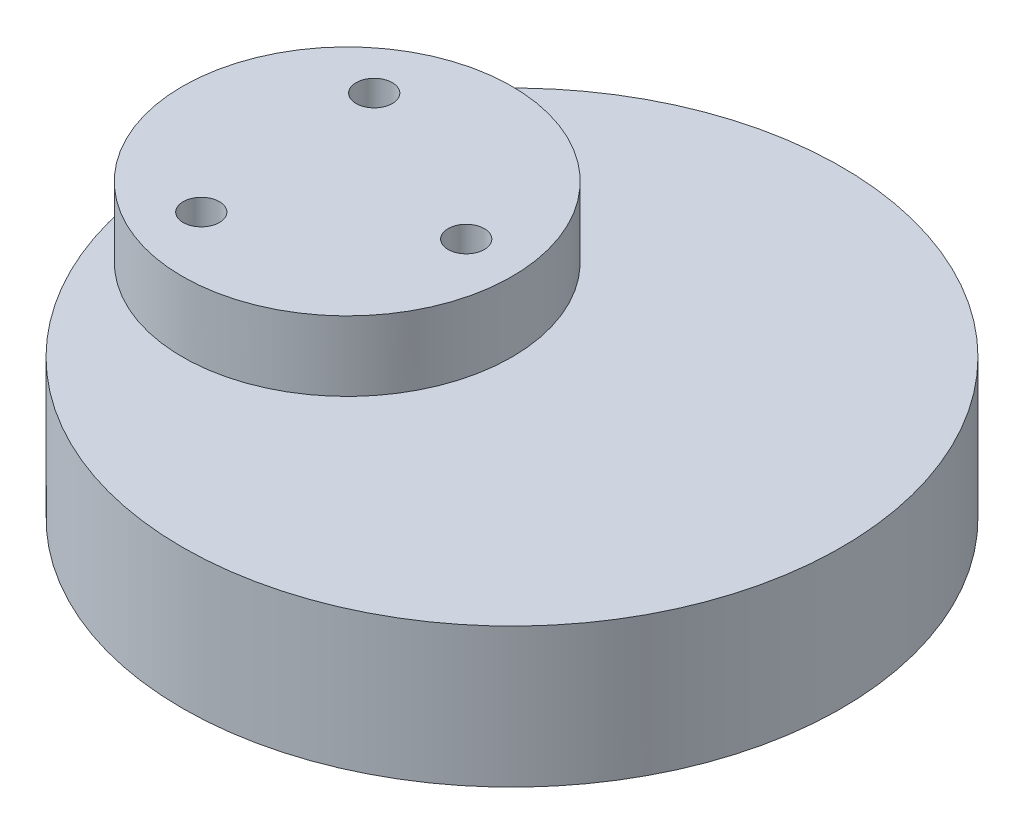
ISO-10303-21;
HEADER;
FILE_DESCRIPTION(('STEP AP214'),'2;1');
FILE_NAME('part.step','',(''),(''),'','','');
FILE_SCHEMA(('AUTOMOTIVE_DESIGN { 1 0 10303 214 1 1 1 1 }'));
ENDSEC;
DATA;
#1=APPLICATION_CONTEXT('core data for automotive mechanical design processes');
#2=APPLICATION_PROTOCOL_DEFINITION('international standard','automotive_design',2000,#1);
#3=PRODUCT_CONTEXT('',#1,'mechanical');
#4=PRODUCT('Part','Part','',(#3));
#5=PRODUCT_RELATED_PRODUCT_CATEGORY('part','',(#4));
#6=PRODUCT_DEFINITION_FORMATION('','',#4);
#7=PRODUCT_DEFINITION_CONTEXT('part definition',#1,'design');
#8=PRODUCT_DEFINITION('design','',#6,#7);
#9=PRODUCT_DEFINITION_SHAPE('','',#8);
#10=(LENGTH_UNIT() NAMED_UNIT(*) SI_UNIT(.MILLI.,.METRE.));
#11=(NAMED_UNIT(*) PLANE_ANGLE_UNIT() SI_UNIT($,.RADIAN.));
#12=(NAMED_UNIT(*) SI_UNIT($,.STERADIAN.) SOLID_ANGLE_UNIT());
#13=UNCERTAINTY_MEASURE_WITH_UNIT(LENGTH_MEASURE(1.E-05),#10,'distance_accuracy_value','');
#14=(GEOMETRIC_REPRESENTATION_CONTEXT(3) GLOBAL_UNCERTAINTY_ASSIGNED_CONTEXT((#13)) GLOBAL_UNIT_ASSIGNED_CONTEXT((#10,
#11,#12)) REPRESENTATION_CONTEXT('',''));
#15=CARTESIAN_POINT('',(0.,0.,0.));
#16=DIRECTION('',(0.,0.,1.));
#17=DIRECTION('',(1.,0.,0.));
#18=AXIS2_PLACEMENT_3D('',#15,#16,#17);
#19=CARTESIAN_POINT('',(0.,6.35,0.));
#20=DIRECTION('',(0.,-1.,0.));
#21=DIRECTION('',(0.,0.,-1.));
#22=AXIS2_PLACEMENT_3D('',#19,#20,#21);
#23=CYLINDRICAL_SURFACE('',#22,15.);
#24=CARTESIAN_POINT('',(0.,6.35,0.));
#25=DIRECTION('',(0.,1.,0.));
#26=DIRECTION('',(0.,0.,1.));
#27=AXIS2_PLACEMENT_3D('',#24,#25,#26);
#28=CIRCLE('',#27,15.);
#29=CARTESIAN_POINT('',(0.,6.35,15.));
#30=VERTEX_POINT('',#29);
#31=EDGE_CURVE('E11',#30,#30,#28,.T.);
#32=ORIENTED_EDGE('',*,*,#31,.F.);
#33=EDGE_LOOP('',(#32));
#34=FACE_BOUND('',#33,.T.);
#35=CARTESIAN_POINT('',(0.,0.,0.));
#36=DIRECTION('',(0.,1.,0.));
#37=DIRECTION('',(0.,0.,1.));
#38=AXIS2_PLACEMENT_3D('',#35,#36,#37);
#39=CIRCLE('',#38,15.);
#40=CARTESIAN_POINT('',(-15.,0.,0.));
#41=VERTEX_POINT('',#40);
#42=EDGE_CURVE('E48',#41,#41,#39,.T.);
#43=ORIENTED_EDGE('',*,*,#42,.T.);
#44=EDGE_LOOP('',(#43));
#45=FACE_BOUND('',#44,.T.);
#46=ADVANCED_FACE('F45',(#34,#45),#23,.T.);
#47=CARTESIAN_POINT('',(0.,6.35,0.));
#48=DIRECTION('',(0.,1.,0.));
#49=DIRECTION('',(0.,0.,1.));
#50=AXIS2_PLACEMENT_3D('',#47,#48,#49);
#51=PLANE('',#50);
#52=CARTESIAN_POINT('',(-4.226182617407,6.35,9.0630778703665));
#53=DIRECTION('',(0.,1.,0.));
#54=DIRECTION('',(0.,0.,1.));
#55=AXIS2_PLACEMENT_3D('',#52,#53,#54);
#56=CIRCLE('',#55,1.64999999999999);
#57=CARTESIAN_POINT('',(-4.226182617407,6.35,10.7130778703665));
#58=VERTEX_POINT('',#57);
#59=EDGE_CURVE('E105',#58,#58,#56,.T.);
#60=ORIENTED_EDGE('',*,*,#59,.F.);
#61=EDGE_LOOP('',(#60));
#62=FACE_BOUND('',#61,.T.);
#63=CARTESIAN_POINT('',(9.96194698091746,6.35,-0.87155742747655));
#64=DIRECTION('',(0.,1.,0.));
#65=DIRECTION('',(0.,0.,1.));
#66=AXIS2_PLACEMENT_3D('',#63,#64,#65);
#67=CIRCLE('',#66,1.64999999999999);
#68=CARTESIAN_POINT('',(9.96194698091746,6.35,0.77844257252344));
#69=VERTEX_POINT('',#68);
#70=EDGE_CURVE('E111',#69,#69,#67,.T.);
#71=ORIENTED_EDGE('',*,*,#70,.F.);
#72=EDGE_LOOP('',(#71));
#73=FACE_BOUND('',#72,.T.);
#74=CARTESIAN_POINT('',(-5.73576436351042,6.35,-8.19152044288995));
#75=DIRECTION('',(0.,1.,0.));
#76=DIRECTION('',(0.,0.,1.));
#77=AXIS2_PLACEMENT_3D('',#74,#75,#76);
#78=CIRCLE('',#77,1.64999999999999);
#79=CARTESIAN_POINT('',(-5.73576436351042,6.35,-6.54152044288996));
#80=VERTEX_POINT('',#79);
#81=EDGE_CURVE('E118',#80,#80,#78,.T.);
#82=ORIENTED_EDGE('',*,*,#81,.F.);
#83=EDGE_LOOP('',(#82));
#84=FACE_BOUND('',#83,.T.);
#85=ORIENTED_EDGE('',*,*,#31,.T.);
#86=EDGE_LOOP('',(#85));
#87=FACE_BOUND('',#86,.T.);
#88=ADVANCED_FACE('F134',(#62,#73,#84,#87),#51,.T.);
#89=CARTESIAN_POINT('',(15.,-12.7,0.));
#90=DIRECTION('',(0.,1.,0.));
#91=DIRECTION('',(0.,0.,1.));
#92=AXIS2_PLACEMENT_3D('',#89,#90,#91);
#93=CYLINDRICAL_SURFACE('',#92,30.);
#94=CARTESIAN_POINT('',(15.,-12.7,0.));
#95=DIRECTION('',(0.,1.,0.));
#96=DIRECTION('',(0.,0.,1.));
#97=AXIS2_PLACEMENT_3D('',#94,#95,#96);
#98=CIRCLE('',#97,30.);
#99=CARTESIAN_POINT('',(15.,-12.7,30.));
#100=VERTEX_POINT('',#99);
#101=EDGE_CURVE('E124',#100,#100,#98,.T.);
#102=ORIENTED_EDGE('',*,*,#101,.T.);
#103=EDGE_LOOP('',(#102));
#104=FACE_BOUND('',#103,.T.);
#105=CARTESIAN_POINT('',(15.,0.,0.));
#106=DIRECTION('',(0.,1.,0.));
#107=DIRECTION('',(0.,0.,1.));
#108=AXIS2_PLACEMENT_3D('',#105,#106,#107);
#109=CIRCLE('',#108,30.);
#110=EDGE_CURVE('E58',#41,#41,#109,.T.);
#111=ORIENTED_EDGE('',*,*,#110,.F.);
#112=EDGE_LOOP('',(#111));
#113=FACE_BOUND('',#112,.T.);
#114=ADVANCED_FACE('F139',(#104,#113),#93,.T.);
#115=CARTESIAN_POINT('',(0.,-12.7,0.));
#116=DIRECTION('',(0.,1.,0.));
#117=DIRECTION('',(0.,0.,1.));
#118=AXIS2_PLACEMENT_3D('',#115,#116,#117);
#119=PLANE('',#118);
#120=CARTESIAN_POINT('',(15.,-12.7,20.));
#121=DIRECTION('',(0.,-1.,0.));
#122=DIRECTION('',(0.,0.,-1.));
#123=AXIS2_PLACEMENT_3D('',#120,#121,#122);
#124=CIRCLE('',#123,1.64999999999999);
#125=CARTESIAN_POINT('',(15.,-12.7,18.35));
#126=VERTEX_POINT('',#125);
#127=EDGE_CURVE('E89',#126,#126,#124,.T.);
#128=ORIENTED_EDGE('',*,*,#127,.F.);
#129=EDGE_LOOP('',(#128));
#130=FACE_BOUND('',#129,.T.);
#131=CARTESIAN_POINT('',(-2.32050807568879,-12.7,-9.99999999999996));
#132=DIRECTION('',(0.,-1.,0.));
#133=DIRECTION('',(0.,0.,-1.));
#134=AXIS2_PLACEMENT_3D('',#131,#132,#133);
#135=CIRCLE('',#134,1.64999999999999);
#136=CARTESIAN_POINT('',(-2.32050807568879,-12.7,-11.65));
#137=VERTEX_POINT('',#136);
#138=EDGE_CURVE('E88',#137,#137,#135,.T.);
#139=ORIENTED_EDGE('',*,*,#138,.F.);
#140=EDGE_LOOP('',(#139));
#141=FACE_BOUND('',#140,.T.);
#142=CARTESIAN_POINT('',(32.3205080756887,-12.7,-10.0000000000001));
#143=DIRECTION('',(0.,-1.,0.));
#144=DIRECTION('',(0.,0.,-1.));
#145=AXIS2_PLACEMENT_3D('',#142,#143,#144);
#146=CIRCLE('',#145,1.64999999999999);
#147=CARTESIAN_POINT('',(32.3205080756887,-12.7,-11.6500000000001));
#148=VERTEX_POINT('',#147);
#149=EDGE_CURVE('E99',#148,#148,#146,.T.);
#150=ORIENTED_EDGE('',*,*,#149,.F.);
#151=EDGE_LOOP('',(#150));
#152=FACE_BOUND('',#151,.T.);
#153=ORIENTED_EDGE('',*,*,#101,.F.);
#154=EDGE_LOOP('',(#153));
#155=FACE_BOUND('',#154,.T.);
#156=ADVANCED_FACE('F146',(#130,#141,#152,#155),#119,.F.);
#157=CARTESIAN_POINT('',(0.,0.,0.));
#158=DIRECTION('',(0.,1.,0.));
#159=DIRECTION('',(0.,0.,1.));
#160=AXIS2_PLACEMENT_3D('',#157,#158,#159);
#161=PLANE('',#160);
#162=ORIENTED_EDGE('',*,*,#110,.T.);
#163=ORIENTED_EDGE('',*,*,#42,.F.);
#164=EDGE_LOOP('',(#162,#163));
#165=FACE_BOUND('',#164,.T.);
#166=ADVANCED_FACE('F129',(#165),#161,.T.);
#167=CARTESIAN_POINT('',(-5.73576436351042,-3.75,-8.19152044288995));
#168=DIRECTION('',(0.,1.,0.));
#169=DIRECTION('',(0.,0.,1.));
#170=AXIS2_PLACEMENT_3D('',#167,#168,#169);
#171=CONICAL_SURFACE('',#170,1.64999999999999,1.02974425867665);
#172=CARTESIAN_POINT('',(-5.73576436351042,-4.74142002139548,-8.19152044288995));
#173=VERTEX_POINT('',#172);
#174=VERTEX_LOOP('',#173);
#175=FACE_BOUND('',#174,.T.);
#176=CARTESIAN_POINT('',(-5.73576436351042,-3.75,-8.19152044288995));
#177=DIRECTION('',(0.,1.,0.));
#178=DIRECTION('',(0.,0.,1.));
#179=AXIS2_PLACEMENT_3D('',#176,#177,#178);
#180=CIRCLE('',#179,1.64999999999999);
#181=CARTESIAN_POINT('',(-5.73576436351042,-3.75,-6.54152044288996));
#182=VERTEX_POINT('',#181);
#183=EDGE_CURVE('E121',#182,#182,#180,.T.);
#184=ORIENTED_EDGE('',*,*,#183,.T.);
#185=EDGE_LOOP('',(#184));
#186=FACE_BOUND('',#185,.T.);
#187=ADVANCED_FACE('F154',(#175,#186),#171,.F.);
#188=CARTESIAN_POINT('',(-5.73576436351042,6.35,-8.19152044288995));
#189=DIRECTION('',(0.,1.,0.));
#190=DIRECTION('',(0.,0.,1.));
#191=AXIS2_PLACEMENT_3D('',#188,#189,#190);
#192=CYLINDRICAL_SURFACE('',#191,1.64999999999999);
#193=ORIENTED_EDGE('',*,*,#183,.F.);
#194=EDGE_LOOP('',(#193));
#195=FACE_BOUND('',#194,.T.);
#196=ORIENTED_EDGE('',*,*,#81,.T.);
#197=EDGE_LOOP('',(#196));
#198=FACE_BOUND('',#197,.T.);
#199=ADVANCED_FACE('F160',(#195,#198),#192,.F.);
#200=CARTESIAN_POINT('',(9.96194698091746,-3.75,-0.87155742747655));
#201=DIRECTION('',(0.,1.,0.));
#202=DIRECTION('',(0.,0.,1.));
#203=AXIS2_PLACEMENT_3D('',#200,#201,#202);
#204=CONICAL_SURFACE('',#203,1.64999999999999,1.02974425867665);
#205=CARTESIAN_POINT('',(9.96194698091746,-4.74142002139548,-0.87155742747655));
#206=VERTEX_POINT('',#205);
#207=VERTEX_LOOP('',#206);
#208=FACE_BOUND('',#207,.T.);
#209=CARTESIAN_POINT('',(9.96194698091746,-3.75,-0.87155742747655));
#210=DIRECTION('',(0.,1.,0.));
#211=DIRECTION('',(0.,0.,1.));
#212=AXIS2_PLACEMENT_3D('',#209,#210,#211);
#213=CIRCLE('',#212,1.64999999999999);
#214=CARTESIAN_POINT('',(9.96194698091746,-3.75,0.778442572523438));
#215=VERTEX_POINT('',#214);
#216=EDGE_CURVE('E114',#215,#215,#213,.T.);
#217=ORIENTED_EDGE('',*,*,#216,.T.);
#218=EDGE_LOOP('',(#217));
#219=FACE_BOUND('',#218,.T.);
#220=ADVANCED_FACE('F163',(#208,#219),#204,.F.);
#221=CARTESIAN_POINT('',(9.96194698091746,6.35,-0.87155742747655));
#222=DIRECTION('',(0.,1.,0.));
#223=DIRECTION('',(0.,0.,1.));
#224=AXIS2_PLACEMENT_3D('',#221,#222,#223);
#225=CYLINDRICAL_SURFACE('',#224,1.64999999999999);
#226=ORIENTED_EDGE('',*,*,#216,.F.);
#227=EDGE_LOOP('',(#226));
#228=FACE_BOUND('',#227,.T.);
#229=ORIENTED_EDGE('',*,*,#70,.T.);
#230=EDGE_LOOP('',(#229));
#231=FACE_BOUND('',#230,.T.);
#232=ADVANCED_FACE('F167',(#228,#231),#225,.F.);
#233=CARTESIAN_POINT('',(-4.226182617407,-3.75,9.0630778703665));
#234=DIRECTION('',(0.,1.,0.));
#235=DIRECTION('',(0.,0.,1.));
#236=AXIS2_PLACEMENT_3D('',#233,#234,#235);
#237=CONICAL_SURFACE('',#236,1.64999999999999,1.02974425867665);
#238=CARTESIAN_POINT('',(-4.22618261740701,-4.74142002139548,9.0630778703665));
#239=VERTEX_POINT('',#238);
#240=VERTEX_LOOP('',#239);
#241=FACE_BOUND('',#240,.T.);
#242=CARTESIAN_POINT('',(-4.226182617407,-3.75,9.0630778703665));
#243=DIRECTION('',(0.,1.,0.));
#244=DIRECTION('',(0.,0.,1.));
#245=AXIS2_PLACEMENT_3D('',#242,#243,#244);
#246=CIRCLE('',#245,1.64999999999999);
#247=CARTESIAN_POINT('',(-4.226182617407,-3.75,10.7130778703665));
#248=VERTEX_POINT('',#247);
#249=EDGE_CURVE('E108',#248,#248,#246,.T.);
#250=ORIENTED_EDGE('',*,*,#249,.T.);
#251=EDGE_LOOP('',(#250));
#252=FACE_BOUND('',#251,.T.);
#253=ADVANCED_FACE('F171',(#241,#252),#237,.F.);
#254=CARTESIAN_POINT('',(-4.226182617407,6.35,9.0630778703665));
#255=DIRECTION('',(0.,1.,0.));
#256=DIRECTION('',(0.,0.,1.));
#257=AXIS2_PLACEMENT_3D('',#254,#255,#256);
#258=CYLINDRICAL_SURFACE('',#257,1.64999999999999);
#259=ORIENTED_EDGE('',*,*,#249,.F.);
#260=EDGE_LOOP('',(#259));
#261=FACE_BOUND('',#260,.T.);
#262=ORIENTED_EDGE('',*,*,#59,.T.);
#263=EDGE_LOOP('',(#262));
#264=FACE_BOUND('',#263,.T.);
#265=ADVANCED_FACE('F175',(#261,#264),#258,.F.);
#266=CARTESIAN_POINT('',(32.3205080756887,-2.6,-10.0000000000001));
#267=DIRECTION('',(0.,-1.,0.));
#268=DIRECTION('',(0.,0.,-1.));
#269=AXIS2_PLACEMENT_3D('',#266,#267,#268);
#270=CONICAL_SURFACE('',#269,1.64999999999998,1.02974425867665);
#271=CARTESIAN_POINT('',(32.3205080756887,-1.60857997860452,-10.0000000000001));
#272=VERTEX_POINT('',#271);
#273=VERTEX_LOOP('',#272);
#274=FACE_BOUND('',#273,.T.);
#275=CARTESIAN_POINT('',(32.3205080756887,-2.6,-10.0000000000001));
#276=DIRECTION('',(0.,-1.,0.));
#277=DIRECTION('',(0.,0.,-1.));
#278=AXIS2_PLACEMENT_3D('',#275,#276,#277);
#279=CIRCLE('',#278,1.64999999999998);
#280=CARTESIAN_POINT('',(32.3205080756887,-2.6,-11.6500000000001));
#281=VERTEX_POINT('',#280);
#282=EDGE_CURVE('E102',#281,#281,#279,.T.);
#283=ORIENTED_EDGE('',*,*,#282,.T.);
#284=EDGE_LOOP('',(#283));
#285=FACE_BOUND('',#284,.T.);
#286=ADVANCED_FACE('F179',(#274,#285),#270,.F.);
#287=CARTESIAN_POINT('',(32.3205080756887,-12.7,-10.0000000000001));
#288=DIRECTION('',(0.,-1.,0.));
#289=DIRECTION('',(0.,0.,-1.));
#290=AXIS2_PLACEMENT_3D('',#287,#288,#289);
#291=CYLINDRICAL_SURFACE('',#290,1.64999999999999);
#292=ORIENTED_EDGE('',*,*,#282,.F.);
#293=EDGE_LOOP('',(#292));
#294=FACE_BOUND('',#293,.T.);
#295=ORIENTED_EDGE('',*,*,#149,.T.);
#296=EDGE_LOOP('',(#295));
#297=FACE_BOUND('',#296,.T.);
#298=ADVANCED_FACE('F183',(#294,#297),#291,.F.);
#299=CARTESIAN_POINT('',(-2.32050807568879,-2.6,-9.99999999999996));
#300=DIRECTION('',(0.,-1.,0.));
#301=DIRECTION('',(0.,0.,-1.));
#302=AXIS2_PLACEMENT_3D('',#299,#300,#301);
#303=CONICAL_SURFACE('',#302,1.64999999999999,1.02974425867665);
#304=CARTESIAN_POINT('',(-2.3205080756888,-1.60857997860452,-9.99999999999996));
#305=VERTEX_POINT('',#304);
#306=VERTEX_LOOP('',#305);
#307=FACE_BOUND('',#306,.T.);
#308=CARTESIAN_POINT('',(-2.32050807568879,-2.6,-9.99999999999996));
#309=DIRECTION('',(0.,-1.,0.));
#310=DIRECTION('',(0.,0.,-1.));
#311=AXIS2_PLACEMENT_3D('',#308,#309,#310);
#312=CIRCLE('',#311,1.64999999999999);
#313=CARTESIAN_POINT('',(-2.32050807568879,-2.6,-11.6499999999999));
#314=VERTEX_POINT('',#313);
#315=EDGE_CURVE('E92',#314,#314,#312,.T.);
#316=ORIENTED_EDGE('',*,*,#315,.T.);
#317=EDGE_LOOP('',(#316));
#318=FACE_BOUND('',#317,.T.);
#319=ADVANCED_FACE('F187',(#307,#318),#303,.F.);
#320=CARTESIAN_POINT('',(-2.32050807568879,-12.7,-9.99999999999996));
#321=DIRECTION('',(0.,-1.,0.));
#322=DIRECTION('',(0.,0.,-1.));
#323=AXIS2_PLACEMENT_3D('',#320,#321,#322);
#324=CYLINDRICAL_SURFACE('',#323,1.64999999999999);
#325=ORIENTED_EDGE('',*,*,#315,.F.);
#326=EDGE_LOOP('',(#325));
#327=FACE_BOUND('',#326,.T.);
#328=ORIENTED_EDGE('',*,*,#138,.T.);
#329=EDGE_LOOP('',(#328));
#330=FACE_BOUND('',#329,.T.);
#331=ADVANCED_FACE('F82',(#327,#330),#324,.F.);
#332=CARTESIAN_POINT('',(15.,-2.6,20.));
#333=DIRECTION('',(0.,-1.,0.));
#334=DIRECTION('',(0.,0.,-1.));
#335=AXIS2_PLACEMENT_3D('',#332,#333,#334);
#336=CONICAL_SURFACE('',#335,1.64999999999999,1.02974425867665);
#337=CARTESIAN_POINT('',(15.,-1.60857997860452,20.));
#338=VERTEX_POINT('',#337);
#339=VERTEX_LOOP('',#338);
#340=FACE_BOUND('',#339,.T.);
#341=CARTESIAN_POINT('',(15.,-2.6,20.));
#342=DIRECTION('',(0.,-1.,0.));
#343=DIRECTION('',(0.,0.,-1.));
#344=AXIS2_PLACEMENT_3D('',#341,#342,#343);
#345=CIRCLE('',#344,1.64999999999999);
#346=CARTESIAN_POINT('',(15.,-2.6,18.35));
#347=VERTEX_POINT('',#346);
#348=EDGE_CURVE('E86',#347,#347,#345,.T.);
#349=ORIENTED_EDGE('',*,*,#348,.T.);
#350=EDGE_LOOP('',(#349));
#351=FACE_BOUND('',#350,.T.);
#352=ADVANCED_FACE('F78',(#340,#351),#336,.F.);
#353=CARTESIAN_POINT('',(15.,-12.7,20.));
#354=DIRECTION('',(0.,-1.,0.));
#355=DIRECTION('',(0.,0.,-1.));
#356=AXIS2_PLACEMENT_3D('',#353,#354,#355);
#357=CYLINDRICAL_SURFACE('',#356,1.64999999999999);
#358=ORIENTED_EDGE('',*,*,#348,.F.);
#359=EDGE_LOOP('',(#358));
#360=FACE_BOUND('',#359,.T.);
#361=ORIENTED_EDGE('',*,*,#127,.T.);
#362=EDGE_LOOP('',(#361));
#363=FACE_BOUND('',#362,.T.);
#364=ADVANCED_FACE('F81',(#360,#363),#357,.F.);
#365=CLOSED_SHELL('',(#46,#88,#114,#156,#166,#187,#199,#220,#232,#253,#265,#286,#298,#319,#331,
#352,#364));
#366=MANIFOLD_SOLID_BREP('B2',#365);
#367=ADVANCED_BREP_SHAPE_REPRESENTATION('',(#18,#366),#14);
#368=SHAPE_DEFINITION_REPRESENTATION(#9,#367);
ENDSEC;
END-ISO-10303-21;
